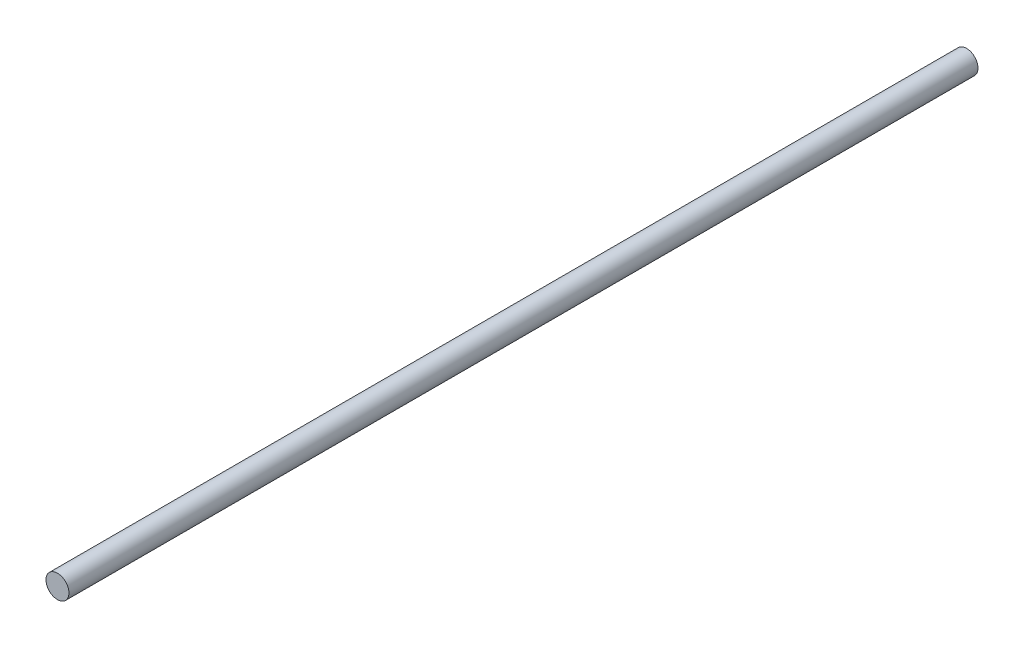
ISO-10303-21;
HEADER;
FILE_DESCRIPTION(('STEP AP214'),'2;1');
FILE_NAME('part.step','',(''),(''),'','','');
FILE_SCHEMA(('AUTOMOTIVE_DESIGN { 1 0 10303 214 1 1 1 1 }'));
ENDSEC;
DATA;
#1=APPLICATION_CONTEXT('core data for automotive mechanical design processes');
#2=APPLICATION_PROTOCOL_DEFINITION('international standard','automotive_design',2000,#1);
#3=PRODUCT_CONTEXT('',#1,'mechanical');
#4=PRODUCT('Part','Part','',(#3));
#5=PRODUCT_RELATED_PRODUCT_CATEGORY('part','',(#4));
#6=PRODUCT_DEFINITION_FORMATION('','',#4);
#7=PRODUCT_DEFINITION_CONTEXT('part definition',#1,'design');
#8=PRODUCT_DEFINITION('design','',#6,#7);
#9=PRODUCT_DEFINITION_SHAPE('','',#8);
#10=(LENGTH_UNIT() NAMED_UNIT(*) SI_UNIT(.MILLI.,.METRE.));
#11=(NAMED_UNIT(*) PLANE_ANGLE_UNIT() SI_UNIT($,.RADIAN.));
#12=(NAMED_UNIT(*) SI_UNIT($,.STERADIAN.) SOLID_ANGLE_UNIT());
#13=UNCERTAINTY_MEASURE_WITH_UNIT(LENGTH_MEASURE(1.E-05),#10,'distance_accuracy_value','');
#14=(GEOMETRIC_REPRESENTATION_CONTEXT(3) GLOBAL_UNCERTAINTY_ASSIGNED_CONTEXT((#13)) GLOBAL_UNIT_ASSIGNED_CONTEXT((#10,
#11,#12)) REPRESENTATION_CONTEXT('',''));
#15=CARTESIAN_POINT('',(0.,0.,0.));
#16=DIRECTION('',(0.,0.,1.));
#17=DIRECTION('',(1.,0.,0.));
#18=AXIS2_PLACEMENT_3D('',#15,#16,#17);
#19=CARTESIAN_POINT('',(0.,0.,-251.46));
#20=DIRECTION('',(0.,0.,1.));
#21=DIRECTION('',(1.,0.,0.));
#22=AXIS2_PLACEMENT_3D('',#19,#20,#21);
#23=CYLINDRICAL_SURFACE('',#22,3.175);
#24=CARTESIAN_POINT('',(0.,0.,-251.46));
#25=DIRECTION('',(0.,0.,1.));
#26=DIRECTION('',(1.,0.,0.));
#27=AXIS2_PLACEMENT_3D('',#24,#25,#26);
#28=CIRCLE('',#27,3.175);
#29=CARTESIAN_POINT('',(3.175,0.,-251.46));
#30=VERTEX_POINT('',#29);
#31=EDGE_CURVE('E10',#30,#30,#28,.T.);
#32=ORIENTED_EDGE('',*,*,#31,.T.);
#33=EDGE_LOOP('',(#32));
#34=FACE_BOUND('',#33,.T.);
#35=CARTESIAN_POINT('',(0.,0.,0.));
#36=DIRECTION('',(0.,0.,1.));
#37=DIRECTION('',(1.,0.,0.));
#38=AXIS2_PLACEMENT_3D('',#35,#36,#37);
#39=CIRCLE('',#38,3.175);
#40=CARTESIAN_POINT('',(3.175,0.,0.));
#41=VERTEX_POINT('',#40);
#42=EDGE_CURVE('E46',#41,#41,#39,.T.);
#43=ORIENTED_EDGE('',*,*,#42,.F.);
#44=EDGE_LOOP('',(#43));
#45=FACE_BOUND('',#44,.T.);
#46=ADVANCED_FACE('F43',(#34,#45),#23,.T.);
#47=CARTESIAN_POINT('',(0.,0.,-251.46));
#48=DIRECTION('',(0.,0.,1.));
#49=DIRECTION('',(1.,0.,0.));
#50=AXIS2_PLACEMENT_3D('',#47,#48,#49);
#51=PLANE('',#50);
#52=ORIENTED_EDGE('',*,*,#31,.F.);
#53=EDGE_LOOP('',(#52));
#54=FACE_BOUND('',#53,.T.);
#55=ADVANCED_FACE('F60',(#54),#51,.F.);
#56=CARTESIAN_POINT('',(0.,0.,0.));
#57=DIRECTION('',(0.,0.,1.));
#58=DIRECTION('',(1.,0.,0.));
#59=AXIS2_PLACEMENT_3D('',#56,#57,#58);
#60=PLANE('',#59);
#61=ORIENTED_EDGE('',*,*,#42,.T.);
#62=EDGE_LOOP('',(#61));
#63=FACE_BOUND('',#62,.T.);
#64=ADVANCED_FACE('F57',(#63),#60,.T.);
#65=CLOSED_SHELL('',(#46,#55,#64));
#66=MANIFOLD_SOLID_BREP('B2',#65);
#67=ADVANCED_BREP_SHAPE_REPRESENTATION('',(#18,#66),#14);
#68=SHAPE_DEFINITION_REPRESENTATION(#9,#67);
ENDSEC;
END-ISO-10303-21;
